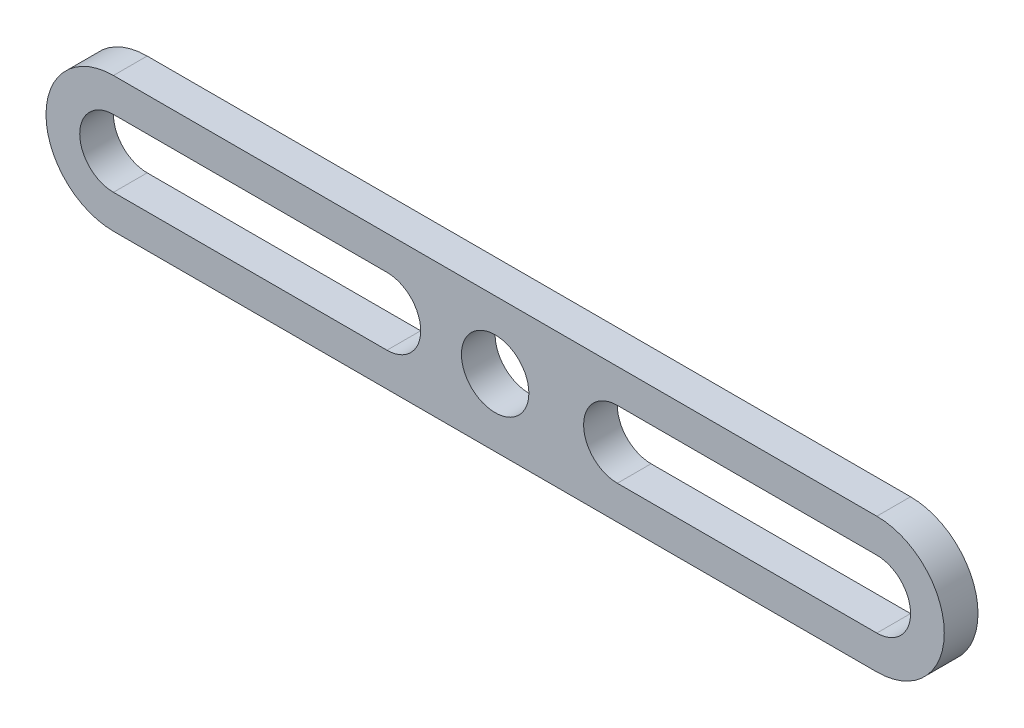
ISO-10303-21;
HEADER;
FILE_DESCRIPTION(('STEP AP214'),'2;1');
FILE_NAME('part.step','',(''),(''),'','','');
FILE_SCHEMA(('AUTOMOTIVE_DESIGN { 1 0 10303 214 1 1 1 1 }'));
ENDSEC;
DATA;
#1=APPLICATION_CONTEXT('core data for automotive mechanical design processes');
#2=APPLICATION_PROTOCOL_DEFINITION('international standard','automotive_design',2000,#1);
#3=PRODUCT_CONTEXT('',#1,'mechanical');
#4=PRODUCT('Part','Part','',(#3));
#5=PRODUCT_RELATED_PRODUCT_CATEGORY('part','',(#4));
#6=PRODUCT_DEFINITION_FORMATION('','',#4);
#7=PRODUCT_DEFINITION_CONTEXT('part definition',#1,'design');
#8=PRODUCT_DEFINITION('design','',#6,#7);
#9=PRODUCT_DEFINITION_SHAPE('','',#8);
#10=(LENGTH_UNIT() NAMED_UNIT(*) SI_UNIT(.MILLI.,.METRE.));
#11=(NAMED_UNIT(*) PLANE_ANGLE_UNIT() SI_UNIT($,.RADIAN.));
#12=(NAMED_UNIT(*) SI_UNIT($,.STERADIAN.) SOLID_ANGLE_UNIT());
#13=UNCERTAINTY_MEASURE_WITH_UNIT(LENGTH_MEASURE(1.E-05),#10,'distance_accuracy_value','');
#14=(GEOMETRIC_REPRESENTATION_CONTEXT(3) GLOBAL_UNCERTAINTY_ASSIGNED_CONTEXT((#13)) GLOBAL_UNIT_ASSIGNED_CONTEXT((#10,
#11,#12)) REPRESENTATION_CONTEXT('',''));
#15=CARTESIAN_POINT('',(0.,0.,0.));
#16=DIRECTION('',(0.,0.,1.));
#17=DIRECTION('',(1.,0.,0.));
#18=AXIS2_PLACEMENT_3D('',#15,#16,#17);
#19=CARTESIAN_POINT('',(24.3313220369423,0.,3.));
#20=DIRECTION('',(0.,0.,-1.));
#21=DIRECTION('',(-1.,0.,0.));
#22=AXIS2_PLACEMENT_3D('',#19,#20,#21);
#23=CYLINDRICAL_SURFACE('',#22,3.);
#24=CARTESIAN_POINT('',(24.3313220369423,0.,0.));
#25=DIRECTION('',(0.,0.,-1.));
#26=DIRECTION('',(1.,0.,0.));
#27=AXIS2_PLACEMENT_3D('',#24,#25,#26);
#28=CIRCLE('',#27,3.);
#29=CARTESIAN_POINT('',(24.3313220369423,3.,0.));
#30=VERTEX_POINT('',#29);
#31=CARTESIAN_POINT('',(24.3313220369423,-3.,0.));
#32=VERTEX_POINT('',#31);
#33=EDGE_CURVE('E11',#30,#32,#28,.T.);
#34=ORIENTED_EDGE('',*,*,#33,.T.);
#35=DIRECTION('',(0.,0.,-1.));
#36=VECTOR('',#35,1.);
#37=CARTESIAN_POINT('',(24.3313220369423,-3.,3.));
#38=LINE('',#37,#36);
#39=CARTESIAN_POINT('',(24.3313220369423,-3.,3.));
#40=VERTEX_POINT('',#39);
#41=EDGE_CURVE('E24',#40,#32,#38,.T.);
#42=ORIENTED_EDGE('',*,*,#41,.F.);
#43=CARTESIAN_POINT('',(24.3313220369423,0.,3.));
#44=DIRECTION('',(0.,0.,-1.));
#45=DIRECTION('',(1.,0.,0.));
#46=AXIS2_PLACEMENT_3D('',#43,#44,#45);
#47=CIRCLE('',#46,3.);
#48=CARTESIAN_POINT('',(24.3313220369423,3.,3.));
#49=VERTEX_POINT('',#48);
#50=EDGE_CURVE('E193',#49,#40,#47,.T.);
#51=ORIENTED_EDGE('',*,*,#50,.F.);
#52=DIRECTION('',(0.,0.,-1.));
#53=VECTOR('',#52,1.);
#54=CARTESIAN_POINT('',(24.3313220369423,3.,3.));
#55=LINE('',#54,#53);
#56=EDGE_CURVE('E191',#49,#30,#55,.T.);
#57=ORIENTED_EDGE('',*,*,#56,.T.);
#58=EDGE_LOOP('',(#34,#42,#51,#57));
#59=FACE_BOUND('',#58,.T.);
#60=ADVANCED_FACE('F17',(#59),#23,.F.);
#61=CARTESIAN_POINT('',(12.1656610184712,-3.,3.));
#62=DIRECTION('',(0.,1.,0.));
#63=DIRECTION('',(0.,0.,1.));
#64=AXIS2_PLACEMENT_3D('',#61,#62,#63);
#65=PLANE('',#64);
#66=DIRECTION('',(1.,0.,0.));
#67=VECTOR('',#66,1.);
#68=CARTESIAN_POINT('',(12.1656610184712,-3.,0.));
#69=LINE('',#68,#67);
#70=CARTESIAN_POINT('',(0.,-3.,0.));
#71=VERTEX_POINT('',#70);
#72=EDGE_CURVE('E188',#71,#32,#69,.T.);
#73=ORIENTED_EDGE('',*,*,#72,.F.);
#74=DIRECTION('',(0.,0.,-1.));
#75=VECTOR('',#74,1.);
#76=CARTESIAN_POINT('',(0.,-3.,3.));
#77=LINE('',#76,#75);
#78=CARTESIAN_POINT('',(0.,-3.,3.));
#79=VERTEX_POINT('',#78);
#80=EDGE_CURVE('E185',#79,#71,#77,.T.);
#81=ORIENTED_EDGE('',*,*,#80,.F.);
#82=DIRECTION('',(1.,0.,0.));
#83=VECTOR('',#82,1.);
#84=CARTESIAN_POINT('',(12.1656610184712,-3.,3.));
#85=LINE('',#84,#83);
#86=EDGE_CURVE('E183',#79,#40,#85,.T.);
#87=ORIENTED_EDGE('',*,*,#86,.T.);
#88=ORIENTED_EDGE('',*,*,#41,.T.);
#89=EDGE_LOOP('',(#73,#81,#87,#88));
#90=FACE_BOUND('',#89,.T.);
#91=ADVANCED_FACE('F196',(#90),#65,.T.);
#92=CARTESIAN_POINT('',(0.,0.,3.));
#93=DIRECTION('',(0.,0.,-1.));
#94=DIRECTION('',(-1.,0.,0.));
#95=AXIS2_PLACEMENT_3D('',#92,#93,#94);
#96=CYLINDRICAL_SURFACE('',#95,3.);
#97=CARTESIAN_POINT('',(0.,0.,0.));
#98=DIRECTION('',(0.,0.,-1.));
#99=DIRECTION('',(1.,0.,0.));
#100=AXIS2_PLACEMENT_3D('',#97,#98,#99);
#101=CIRCLE('',#100,3.);
#102=CARTESIAN_POINT('',(0.,3.,0.));
#103=VERTEX_POINT('',#102);
#104=EDGE_CURVE('E181',#71,#103,#101,.T.);
#105=ORIENTED_EDGE('',*,*,#104,.T.);
#106=DIRECTION('',(0.,0.,-1.));
#107=VECTOR('',#106,1.);
#108=CARTESIAN_POINT('',(0.,3.,3.));
#109=LINE('',#108,#107);
#110=CARTESIAN_POINT('',(0.,3.,3.));
#111=VERTEX_POINT('',#110);
#112=EDGE_CURVE('E178',#111,#103,#109,.T.);
#113=ORIENTED_EDGE('',*,*,#112,.F.);
#114=CARTESIAN_POINT('',(0.,0.,3.));
#115=DIRECTION('',(0.,0.,-1.));
#116=DIRECTION('',(1.,0.,0.));
#117=AXIS2_PLACEMENT_3D('',#114,#115,#116);
#118=CIRCLE('',#117,3.);
#119=EDGE_CURVE('E175',#79,#111,#118,.T.);
#120=ORIENTED_EDGE('',*,*,#119,.F.);
#121=ORIENTED_EDGE('',*,*,#80,.T.);
#122=EDGE_LOOP('',(#105,#113,#120,#121));
#123=FACE_BOUND('',#122,.T.);
#124=ADVANCED_FACE('F204',(#123),#96,.F.);
#125=CARTESIAN_POINT('',(33.9546932975252,6.,3.));
#126=DIRECTION('',(0.,1.,0.));
#127=DIRECTION('',(0.,0.,1.));
#128=AXIS2_PLACEMENT_3D('',#125,#126,#127);
#129=PLANE('',#128);
#130=DIRECTION('',(1.,0.,0.));
#131=VECTOR('',#130,1.);
#132=CARTESIAN_POINT('',(33.9546932975252,6.,0.));
#133=LINE('',#132,#131);
#134=CARTESIAN_POINT('',(0.,6.,0.));
#135=VERTEX_POINT('',#134);
#136=CARTESIAN_POINT('',(67.9093865950504,6.,0.));
#137=VERTEX_POINT('',#136);
#138=EDGE_CURVE('E172',#135,#137,#133,.T.);
#139=ORIENTED_EDGE('',*,*,#138,.F.);
#140=DIRECTION('',(0.,0.,-1.));
#141=VECTOR('',#140,1.);
#142=CARTESIAN_POINT('',(0.,6.,3.));
#143=LINE('',#142,#141);
#144=CARTESIAN_POINT('',(0.,6.,3.));
#145=VERTEX_POINT('',#144);
#146=EDGE_CURVE('E169',#145,#135,#143,.T.);
#147=ORIENTED_EDGE('',*,*,#146,.F.);
#148=DIRECTION('',(1.,0.,0.));
#149=VECTOR('',#148,1.);
#150=CARTESIAN_POINT('',(33.9546932975252,6.,3.));
#151=LINE('',#150,#149);
#152=CARTESIAN_POINT('',(67.9093865950504,6.,3.));
#153=VERTEX_POINT('',#152);
#154=EDGE_CURVE('E167',#145,#153,#151,.T.);
#155=ORIENTED_EDGE('',*,*,#154,.T.);
#156=DIRECTION('',(0.,0.,-1.));
#157=VECTOR('',#156,1.);
#158=CARTESIAN_POINT('',(67.9093865950504,6.,3.));
#159=LINE('',#158,#157);
#160=EDGE_CURVE('E165',#153,#137,#159,.T.);
#161=ORIENTED_EDGE('',*,*,#160,.T.);
#162=EDGE_LOOP('',(#139,#147,#155,#161));
#163=FACE_BOUND('',#162,.T.);
#164=ADVANCED_FACE('F223',(#163),#129,.T.);
#165=CARTESIAN_POINT('',(0.,0.,3.));
#166=DIRECTION('',(0.,0.,-1.));
#167=DIRECTION('',(-1.,0.,0.));
#168=AXIS2_PLACEMENT_3D('',#165,#166,#167);
#169=CYLINDRICAL_SURFACE('',#168,6.);
#170=CARTESIAN_POINT('',(0.,0.,0.));
#171=DIRECTION('',(0.,0.,-1.));
#172=DIRECTION('',(1.,0.,0.));
#173=AXIS2_PLACEMENT_3D('',#170,#171,#172);
#174=CIRCLE('',#173,6.);
#175=CARTESIAN_POINT('',(0.,-6.,0.));
#176=VERTEX_POINT('',#175);
#177=EDGE_CURVE('E162',#176,#135,#174,.T.);
#178=ORIENTED_EDGE('',*,*,#177,.F.);
#179=DIRECTION('',(0.,0.,-1.));
#180=VECTOR('',#179,1.);
#181=CARTESIAN_POINT('',(0.,-6.,3.));
#182=LINE('',#181,#180);
#183=CARTESIAN_POINT('',(0.,-6.,3.));
#184=VERTEX_POINT('',#183);
#185=EDGE_CURVE('E159',#184,#176,#182,.T.);
#186=ORIENTED_EDGE('',*,*,#185,.F.);
#187=CARTESIAN_POINT('',(0.,0.,3.));
#188=DIRECTION('',(0.,0.,-1.));
#189=DIRECTION('',(1.,0.,0.));
#190=AXIS2_PLACEMENT_3D('',#187,#188,#189);
#191=CIRCLE('',#190,6.);
#192=EDGE_CURVE('E156',#184,#145,#191,.T.);
#193=ORIENTED_EDGE('',*,*,#192,.T.);
#194=ORIENTED_EDGE('',*,*,#146,.T.);
#195=EDGE_LOOP('',(#178,#186,#193,#194));
#196=FACE_BOUND('',#195,.T.);
#197=ADVANCED_FACE('F228',(#196),#169,.T.);
#198=CARTESIAN_POINT('',(33.9546932975252,-6.,3.));
#199=DIRECTION('',(0.,1.,0.));
#200=DIRECTION('',(0.,0.,1.));
#201=AXIS2_PLACEMENT_3D('',#198,#199,#200);
#202=PLANE('',#201);
#203=DIRECTION('',(1.,0.,0.));
#204=VECTOR('',#203,1.);
#205=CARTESIAN_POINT('',(33.9546932975252,-6.,0.));
#206=LINE('',#205,#204);
#207=CARTESIAN_POINT('',(67.9093865950504,-6.,0.));
#208=VERTEX_POINT('',#207);
#209=EDGE_CURVE('E154',#176,#208,#206,.T.);
#210=ORIENTED_EDGE('',*,*,#209,.T.);
#211=DIRECTION('',(0.,0.,-1.));
#212=VECTOR('',#211,1.);
#213=CARTESIAN_POINT('',(67.9093865950504,-6.,3.));
#214=LINE('',#213,#212);
#215=CARTESIAN_POINT('',(67.9093865950504,-6.,3.));
#216=VERTEX_POINT('',#215);
#217=EDGE_CURVE('E151',#216,#208,#214,.T.);
#218=ORIENTED_EDGE('',*,*,#217,.F.);
#219=DIRECTION('',(1.,0.,0.));
#220=VECTOR('',#219,1.);
#221=CARTESIAN_POINT('',(33.9546932975252,-6.,3.));
#222=LINE('',#221,#220);
#223=EDGE_CURVE('E148',#184,#216,#222,.T.);
#224=ORIENTED_EDGE('',*,*,#223,.F.);
#225=ORIENTED_EDGE('',*,*,#185,.T.);
#226=EDGE_LOOP('',(#210,#218,#224,#225));
#227=FACE_BOUND('',#226,.T.);
#228=ADVANCED_FACE('F232',(#227),#202,.F.);
#229=CARTESIAN_POINT('',(44.8254527160917,0.,3.));
#230=DIRECTION('',(0.,0.,-1.));
#231=DIRECTION('',(-1.,0.,0.));
#232=AXIS2_PLACEMENT_3D('',#229,#230,#231);
#233=CYLINDRICAL_SURFACE('',#232,3.);
#234=CARTESIAN_POINT('',(44.8254527160917,0.,0.));
#235=DIRECTION('',(0.,0.,-1.));
#236=DIRECTION('',(1.,0.,0.));
#237=AXIS2_PLACEMENT_3D('',#234,#235,#236);
#238=CIRCLE('',#237,3.);
#239=CARTESIAN_POINT('',(44.8254527160917,-3.,0.));
#240=VERTEX_POINT('',#239);
#241=CARTESIAN_POINT('',(44.8254527160917,3.,0.));
#242=VERTEX_POINT('',#241);
#243=EDGE_CURVE('E146',#240,#242,#238,.T.);
#244=ORIENTED_EDGE('',*,*,#243,.T.);
#245=DIRECTION('',(0.,0.,-1.));
#246=VECTOR('',#245,1.);
#247=CARTESIAN_POINT('',(44.8254527160917,3.,3.));
#248=LINE('',#247,#246);
#249=CARTESIAN_POINT('',(44.8254527160917,3.,3.));
#250=VERTEX_POINT('',#249);
#251=EDGE_CURVE('E143',#250,#242,#248,.T.);
#252=ORIENTED_EDGE('',*,*,#251,.F.);
#253=CARTESIAN_POINT('',(44.8254527160917,0.,3.));
#254=DIRECTION('',(0.,0.,-1.));
#255=DIRECTION('',(1.,0.,0.));
#256=AXIS2_PLACEMENT_3D('',#253,#254,#255);
#257=CIRCLE('',#256,3.);
#258=CARTESIAN_POINT('',(44.8254527160917,-3.,3.));
#259=VERTEX_POINT('',#258);
#260=EDGE_CURVE('E141',#259,#250,#257,.T.);
#261=ORIENTED_EDGE('',*,*,#260,.F.);
#262=DIRECTION('',(0.,0.,-1.));
#263=VECTOR('',#262,1.);
#264=CARTESIAN_POINT('',(44.8254527160917,-3.,3.));
#265=LINE('',#264,#263);
#266=EDGE_CURVE('E117',#259,#240,#265,.T.);
#267=ORIENTED_EDGE('',*,*,#266,.T.);
#268=EDGE_LOOP('',(#244,#252,#261,#267));
#269=FACE_BOUND('',#268,.T.);
#270=ADVANCED_FACE('F236',(#269),#233,.F.);
#271=CARTESIAN_POINT('',(56.367419655571,3.,3.));
#272=DIRECTION('',(0.,1.,0.));
#273=DIRECTION('',(0.,0.,1.));
#274=AXIS2_PLACEMENT_3D('',#271,#272,#273);
#275=PLANE('',#274);
#276=DIRECTION('',(1.,0.,0.));
#277=VECTOR('',#276,1.);
#278=CARTESIAN_POINT('',(56.367419655571,3.,0.));
#279=LINE('',#278,#277);
#280=CARTESIAN_POINT('',(67.9093865950504,3.,0.));
#281=VERTEX_POINT('',#280);
#282=EDGE_CURVE('E138',#242,#281,#279,.T.);
#283=ORIENTED_EDGE('',*,*,#282,.T.);
#284=DIRECTION('',(0.,0.,-1.));
#285=VECTOR('',#284,1.);
#286=CARTESIAN_POINT('',(67.9093865950504,3.,3.));
#287=LINE('',#286,#285);
#288=CARTESIAN_POINT('',(67.9093865950504,3.,3.));
#289=VERTEX_POINT('',#288);
#290=EDGE_CURVE('E136',#289,#281,#287,.T.);
#291=ORIENTED_EDGE('',*,*,#290,.F.);
#292=DIRECTION('',(1.,0.,0.));
#293=VECTOR('',#292,1.);
#294=CARTESIAN_POINT('',(56.367419655571,3.,3.));
#295=LINE('',#294,#293);
#296=EDGE_CURVE('E126',#250,#289,#295,.T.);
#297=ORIENTED_EDGE('',*,*,#296,.F.);
#298=ORIENTED_EDGE('',*,*,#251,.T.);
#299=EDGE_LOOP('',(#283,#291,#297,#298));
#300=FACE_BOUND('',#299,.T.);
#301=ADVANCED_FACE('F240',(#300),#275,.F.);
#302=CARTESIAN_POINT('',(67.9093865950504,0.,3.));
#303=DIRECTION('',(0.,0.,-1.));
#304=DIRECTION('',(-1.,0.,0.));
#305=AXIS2_PLACEMENT_3D('',#302,#303,#304);
#306=CYLINDRICAL_SURFACE('',#305,3.);
#307=CARTESIAN_POINT('',(67.9093865950504,0.,0.));
#308=DIRECTION('',(0.,0.,-1.));
#309=DIRECTION('',(1.,0.,0.));
#310=AXIS2_PLACEMENT_3D('',#307,#308,#309);
#311=CIRCLE('',#310,3.);
#312=CARTESIAN_POINT('',(67.9093865950504,-3.,0.));
#313=VERTEX_POINT('',#312);
#314=EDGE_CURVE('E108',#281,#313,#311,.T.);
#315=ORIENTED_EDGE('',*,*,#314,.T.);
#316=DIRECTION('',(0.,0.,-1.));
#317=VECTOR('',#316,1.);
#318=CARTESIAN_POINT('',(67.9093865950504,-3.,3.));
#319=LINE('',#318,#317);
#320=CARTESIAN_POINT('',(67.9093865950504,-3.,3.));
#321=VERTEX_POINT('',#320);
#322=EDGE_CURVE('E100',#321,#313,#319,.T.);
#323=ORIENTED_EDGE('',*,*,#322,.F.);
#324=CARTESIAN_POINT('',(67.9093865950504,0.,3.));
#325=DIRECTION('',(0.,0.,-1.));
#326=DIRECTION('',(1.,0.,0.));
#327=AXIS2_PLACEMENT_3D('',#324,#325,#326);
#328=CIRCLE('',#327,3.);
#329=EDGE_CURVE('E105',#289,#321,#328,.T.);
#330=ORIENTED_EDGE('',*,*,#329,.F.);
#331=ORIENTED_EDGE('',*,*,#290,.T.);
#332=EDGE_LOOP('',(#315,#323,#330,#331));
#333=FACE_BOUND('',#332,.T.);
#334=ADVANCED_FACE('F102',(#333),#306,.F.);
#335=CARTESIAN_POINT('',(67.9093865950504,0.,3.));
#336=DIRECTION('',(0.,0.,-1.));
#337=DIRECTION('',(-1.,0.,0.));
#338=AXIS2_PLACEMENT_3D('',#335,#336,#337);
#339=CYLINDRICAL_SURFACE('',#338,6.);
#340=CARTESIAN_POINT('',(67.9093865950504,0.,0.));
#341=DIRECTION('',(0.,0.,-1.));
#342=DIRECTION('',(1.,0.,0.));
#343=AXIS2_PLACEMENT_3D('',#340,#341,#342);
#344=CIRCLE('',#343,6.);
#345=EDGE_CURVE('E127',#137,#208,#344,.T.);
#346=ORIENTED_EDGE('',*,*,#345,.F.);
#347=ORIENTED_EDGE('',*,*,#160,.F.);
#348=CARTESIAN_POINT('',(67.9093865950504,0.,3.));
#349=DIRECTION('',(0.,0.,-1.));
#350=DIRECTION('',(1.,0.,0.));
#351=AXIS2_PLACEMENT_3D('',#348,#349,#350);
#352=CIRCLE('',#351,6.);
#353=EDGE_CURVE('E130',#153,#216,#352,.T.);
#354=ORIENTED_EDGE('',*,*,#353,.T.);
#355=ORIENTED_EDGE('',*,*,#217,.T.);
#356=EDGE_LOOP('',(#346,#347,#354,#355));
#357=FACE_BOUND('',#356,.T.);
#358=ADVANCED_FACE('F247',(#357),#339,.T.);
#359=CARTESIAN_POINT('',(33.9546932975252,0.,3.));
#360=DIRECTION('',(0.,0.,-1.));
#361=DIRECTION('',(-1.,0.,0.));
#362=AXIS2_PLACEMENT_3D('',#359,#360,#361);
#363=CYLINDRICAL_SURFACE('',#362,3.);
#364=CARTESIAN_POINT('',(33.9546932975252,0.,3.));
#365=DIRECTION('',(0.,0.,1.));
#366=DIRECTION('',(1.,0.,0.));
#367=AXIS2_PLACEMENT_3D('',#364,#365,#366);
#368=CIRCLE('',#367,3.);
#369=CARTESIAN_POINT('',(36.9546932975252,0.,3.));
#370=VERTEX_POINT('',#369);
#371=EDGE_CURVE('E281',#370,#370,#368,.T.);
#372=ORIENTED_EDGE('',*,*,#371,.T.);
#373=EDGE_LOOP('',(#372));
#374=FACE_BOUND('',#373,.T.);
#375=CARTESIAN_POINT('',(33.9546932975252,0.,0.));
#376=DIRECTION('',(0.,0.,1.));
#377=DIRECTION('',(1.,0.,0.));
#378=AXIS2_PLACEMENT_3D('',#375,#376,#377);
#379=CIRCLE('',#378,3.);
#380=CARTESIAN_POINT('',(36.9546932975252,0.,0.));
#381=VERTEX_POINT('',#380);
#382=EDGE_CURVE('E271',#381,#381,#379,.T.);
#383=ORIENTED_EDGE('',*,*,#382,.F.);
#384=EDGE_LOOP('',(#383));
#385=FACE_BOUND('',#384,.T.);
#386=ADVANCED_FACE('F250',(#374,#385),#363,.F.);
#387=CARTESIAN_POINT('',(56.367419655571,-3.,3.));
#388=DIRECTION('',(0.,1.,0.));
#389=DIRECTION('',(0.,0.,1.));
#390=AXIS2_PLACEMENT_3D('',#387,#388,#389);
#391=PLANE('',#390);
#392=DIRECTION('',(1.,0.,0.));
#393=VECTOR('',#392,1.);
#394=CARTESIAN_POINT('',(56.367419655571,-3.,0.));
#395=LINE('',#394,#393);
#396=EDGE_CURVE('E120',#240,#313,#395,.T.);
#397=ORIENTED_EDGE('',*,*,#396,.F.);
#398=ORIENTED_EDGE('',*,*,#266,.F.);
#399=DIRECTION('',(1.,0.,0.));
#400=VECTOR('',#399,1.);
#401=CARTESIAN_POINT('',(56.367419655571,-3.,3.));
#402=LINE('',#401,#400);
#403=EDGE_CURVE('E115',#259,#321,#402,.T.);
#404=ORIENTED_EDGE('',*,*,#403,.T.);
#405=ORIENTED_EDGE('',*,*,#322,.T.);
#406=EDGE_LOOP('',(#397,#398,#404,#405));
#407=FACE_BOUND('',#406,.T.);
#408=ADVANCED_FACE('F116',(#407),#391,.T.);
#409=CARTESIAN_POINT('',(12.1656610184712,3.,3.));
#410=DIRECTION('',(0.,1.,0.));
#411=DIRECTION('',(0.,0.,1.));
#412=AXIS2_PLACEMENT_3D('',#409,#410,#411);
#413=PLANE('',#412);
#414=DIRECTION('',(1.,0.,0.));
#415=VECTOR('',#414,1.);
#416=CARTESIAN_POINT('',(12.1656610184712,3.,0.));
#417=LINE('',#416,#415);
#418=EDGE_CURVE('E121',#103,#30,#417,.T.);
#419=ORIENTED_EDGE('',*,*,#418,.T.);
#420=ORIENTED_EDGE('',*,*,#56,.F.);
#421=DIRECTION('',(1.,0.,0.));
#422=VECTOR('',#421,1.);
#423=CARTESIAN_POINT('',(12.1656610184712,3.,3.));
#424=LINE('',#423,#422);
#425=EDGE_CURVE('E211',#111,#49,#424,.T.);
#426=ORIENTED_EDGE('',*,*,#425,.F.);
#427=ORIENTED_EDGE('',*,*,#112,.T.);
#428=EDGE_LOOP('',(#419,#420,#426,#427));
#429=FACE_BOUND('',#428,.T.);
#430=ADVANCED_FACE('F208',(#429),#413,.F.);
#431=CARTESIAN_POINT('',(33.9546932975252,0.,3.));
#432=DIRECTION('',(0.,0.,1.));
#433=DIRECTION('',(1.,0.,0.));
#434=AXIS2_PLACEMENT_3D('',#431,#432,#433);
#435=PLANE('',#434);
#436=ORIENTED_EDGE('',*,*,#260,.T.);
#437=ORIENTED_EDGE('',*,*,#296,.T.);
#438=ORIENTED_EDGE('',*,*,#329,.T.);
#439=ORIENTED_EDGE('',*,*,#403,.F.);
#440=EDGE_LOOP('',(#436,#437,#438,#439));
#441=FACE_BOUND('',#440,.T.);
#442=ORIENTED_EDGE('',*,*,#371,.F.);
#443=EDGE_LOOP('',(#442));
#444=FACE_BOUND('',#443,.T.);
#445=ORIENTED_EDGE('',*,*,#154,.F.);
#446=ORIENTED_EDGE('',*,*,#192,.F.);
#447=ORIENTED_EDGE('',*,*,#223,.T.);
#448=ORIENTED_EDGE('',*,*,#353,.F.);
#449=EDGE_LOOP('',(#445,#446,#447,#448));
#450=FACE_BOUND('',#449,.T.);
#451=ORIENTED_EDGE('',*,*,#50,.T.);
#452=ORIENTED_EDGE('',*,*,#86,.F.);
#453=ORIENTED_EDGE('',*,*,#119,.T.);
#454=ORIENTED_EDGE('',*,*,#425,.T.);
#455=EDGE_LOOP('',(#451,#452,#453,#454));
#456=FACE_BOUND('',#455,.T.);
#457=ADVANCED_FACE('F123',(#441,#444,#450,#456),#435,.T.);
#458=CARTESIAN_POINT('',(33.9546932975252,0.,0.));
#459=DIRECTION('',(0.,0.,1.));
#460=DIRECTION('',(1.,0.,0.));
#461=AXIS2_PLACEMENT_3D('',#458,#459,#460);
#462=PLANE('',#461);
#463=ORIENTED_EDGE('',*,*,#243,.F.);
#464=ORIENTED_EDGE('',*,*,#396,.T.);
#465=ORIENTED_EDGE('',*,*,#314,.F.);
#466=ORIENTED_EDGE('',*,*,#282,.F.);
#467=EDGE_LOOP('',(#463,#464,#465,#466));
#468=FACE_BOUND('',#467,.T.);
#469=ORIENTED_EDGE('',*,*,#382,.T.);
#470=EDGE_LOOP('',(#469));
#471=FACE_BOUND('',#470,.T.);
#472=ORIENTED_EDGE('',*,*,#138,.T.);
#473=ORIENTED_EDGE('',*,*,#345,.T.);
#474=ORIENTED_EDGE('',*,*,#209,.F.);
#475=ORIENTED_EDGE('',*,*,#177,.T.);
#476=EDGE_LOOP('',(#472,#473,#474,#475));
#477=FACE_BOUND('',#476,.T.);
#478=ORIENTED_EDGE('',*,*,#33,.F.);
#479=ORIENTED_EDGE('',*,*,#418,.F.);
#480=ORIENTED_EDGE('',*,*,#104,.F.);
#481=ORIENTED_EDGE('',*,*,#72,.T.);
#482=EDGE_LOOP('',(#478,#479,#480,#481));
#483=FACE_BOUND('',#482,.T.);
#484=ADVANCED_FACE('F200',(#468,#471,#477,#483),#462,.F.);
#485=CLOSED_SHELL('',(#60,#91,#124,#164,#197,#228,#270,#301,#334,#358,#386,#408,#430,#457,#484));
#486=MANIFOLD_SOLID_BREP('B1',#485);
#487=ADVANCED_BREP_SHAPE_REPRESENTATION('',(#18,#486),#14);
#488=SHAPE_DEFINITION_REPRESENTATION(#9,#487);
ENDSEC;
END-ISO-10303-21;
